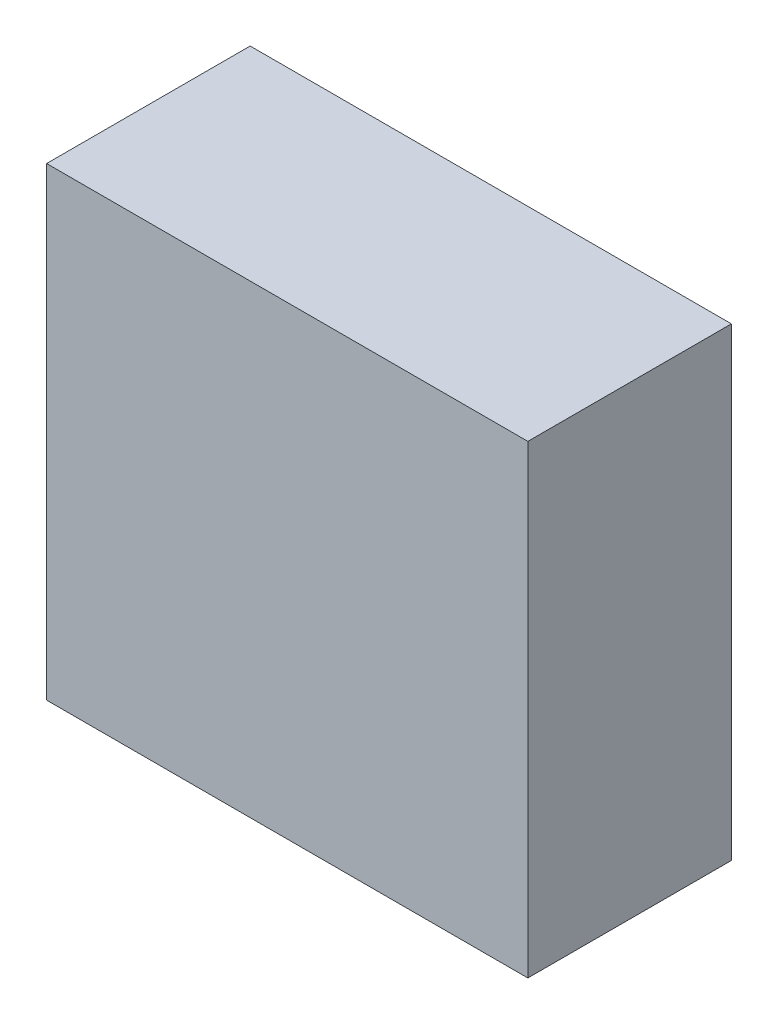
ISO-10303-21;
HEADER;
FILE_DESCRIPTION(('STEP AP214'),'2;1');
FILE_NAME('part.step','',(''),(''),'','','');
FILE_SCHEMA(('AUTOMOTIVE_DESIGN { 1 0 10303 214 1 1 1 1 }'));
ENDSEC;
DATA;
#1=APPLICATION_CONTEXT('core data for automotive mechanical design processes');
#2=APPLICATION_PROTOCOL_DEFINITION('international standard','automotive_design',2000,#1);
#3=PRODUCT_CONTEXT('',#1,'mechanical');
#4=PRODUCT('Part','Part','',(#3));
#5=PRODUCT_RELATED_PRODUCT_CATEGORY('part','',(#4));
#6=PRODUCT_DEFINITION_FORMATION('','',#4);
#7=PRODUCT_DEFINITION_CONTEXT('part definition',#1,'design');
#8=PRODUCT_DEFINITION('design','',#6,#7);
#9=PRODUCT_DEFINITION_SHAPE('','',#8);
#10=(LENGTH_UNIT() NAMED_UNIT(*) SI_UNIT(.MILLI.,.METRE.));
#11=(NAMED_UNIT(*) PLANE_ANGLE_UNIT() SI_UNIT($,.RADIAN.));
#12=(NAMED_UNIT(*) SI_UNIT($,.STERADIAN.) SOLID_ANGLE_UNIT());
#13=UNCERTAINTY_MEASURE_WITH_UNIT(LENGTH_MEASURE(1.E-05),#10,'distance_accuracy_value','');
#14=(GEOMETRIC_REPRESENTATION_CONTEXT(3) GLOBAL_UNCERTAINTY_ASSIGNED_CONTEXT((#13)) GLOBAL_UNIT_ASSIGNED_CONTEXT((#10,
#11,#12)) REPRESENTATION_CONTEXT('',''));
#15=CARTESIAN_POINT('',(0.,0.,0.));
#16=DIRECTION('',(0.,0.,1.));
#17=DIRECTION('',(1.,0.,0.));
#18=AXIS2_PLACEMENT_3D('',#15,#16,#17);
#19=CARTESIAN_POINT('',(-14.6,45.2,-43.));
#20=DIRECTION('',(1.,0.,0.));
#21=DIRECTION('',(0.,0.,-1.));
#22=AXIS2_PLACEMENT_3D('',#19,#20,#21);
#23=PLANE('',#22);
#24=DIRECTION('',(0.,0.,1.));
#25=VECTOR('',#24,1.);
#26=CARTESIAN_POINT('',(-14.6,17.,-43.));
#27=LINE('',#26,#25);
#28=CARTESIAN_POINT('',(-14.6,17.,-43.));
#29=VERTEX_POINT('',#28);
#30=CARTESIAN_POINT('',(-14.6,17.,-30.65));
#31=VERTEX_POINT('',#30);
#32=EDGE_CURVE('E102',#29,#31,#27,.T.);
#33=ORIENTED_EDGE('',*,*,#32,.T.);
#34=DIRECTION('',(0.,-1.,0.));
#35=VECTOR('',#34,1.);
#36=CARTESIAN_POINT('',(-14.6,45.2,-30.65));
#37=LINE('',#36,#35);
#38=CARTESIAN_POINT('',(-14.6,45.2,-30.65));
#39=VERTEX_POINT('',#38);
#40=EDGE_CURVE('E11',#39,#31,#37,.T.);
#41=ORIENTED_EDGE('',*,*,#40,.F.);
#42=DIRECTION('',(0.,0.,1.));
#43=VECTOR('',#42,1.);
#44=CARTESIAN_POINT('',(-14.6,45.2,-43.));
#45=LINE('',#44,#43);
#46=CARTESIAN_POINT('',(-14.6,45.2,-43.));
#47=VERTEX_POINT('',#46);
#48=EDGE_CURVE('E90',#47,#39,#45,.T.);
#49=ORIENTED_EDGE('',*,*,#48,.F.);
#50=DIRECTION('',(0.,-1.,0.));
#51=VECTOR('',#50,1.);
#52=CARTESIAN_POINT('',(-14.6,45.2,-43.));
#53=LINE('',#52,#51);
#54=EDGE_CURVE('E98',#47,#29,#53,.T.);
#55=ORIENTED_EDGE('',*,*,#54,.T.);
#56=EDGE_LOOP('',(#33,#41,#49,#55));
#57=FACE_BOUND('',#56,.T.);
#58=ADVANCED_FACE('F39',(#57),#23,.F.);
#59=CARTESIAN_POINT('',(-14.6,45.2,-30.65));
#60=DIRECTION('',(0.,0.,-1.));
#61=DIRECTION('',(-1.,0.,0.));
#62=AXIS2_PLACEMENT_3D('',#59,#60,#61);
#63=PLANE('',#62);
#64=DIRECTION('',(1.,0.,0.));
#65=VECTOR('',#64,1.);
#66=CARTESIAN_POINT('',(-14.6,17.,-30.65));
#67=LINE('',#66,#65);
#68=CARTESIAN_POINT('',(14.6,17.,-30.65));
#69=VERTEX_POINT('',#68);
#70=EDGE_CURVE('E94',#31,#69,#67,.T.);
#71=ORIENTED_EDGE('',*,*,#70,.T.);
#72=DIRECTION('',(0.,-1.,0.));
#73=VECTOR('',#72,1.);
#74=CARTESIAN_POINT('',(14.6,45.2,-30.65));
#75=LINE('',#74,#73);
#76=CARTESIAN_POINT('',(14.6,45.2,-30.65));
#77=VERTEX_POINT('',#76);
#78=EDGE_CURVE('E47',#77,#69,#75,.T.);
#79=ORIENTED_EDGE('',*,*,#78,.F.);
#80=DIRECTION('',(1.,0.,0.));
#81=VECTOR('',#80,1.);
#82=CARTESIAN_POINT('',(-14.6,45.2,-30.65));
#83=LINE('',#82,#81);
#84=EDGE_CURVE('E85',#39,#77,#83,.T.);
#85=ORIENTED_EDGE('',*,*,#84,.F.);
#86=ORIENTED_EDGE('',*,*,#40,.T.);
#87=EDGE_LOOP('',(#71,#79,#85,#86));
#88=FACE_BOUND('',#87,.T.);
#89=ADVANCED_FACE('F93',(#88),#63,.F.);
#90=CARTESIAN_POINT('',(14.6,45.2,-30.65));
#91=DIRECTION('',(-1.,0.,0.));
#92=DIRECTION('',(0.,0.,1.));
#93=AXIS2_PLACEMENT_3D('',#90,#91,#92);
#94=PLANE('',#93);
#95=DIRECTION('',(0.,0.,-1.));
#96=VECTOR('',#95,1.);
#97=CARTESIAN_POINT('',(14.6,17.,-30.65));
#98=LINE('',#97,#96);
#99=CARTESIAN_POINT('',(14.6,17.,-43.));
#100=VERTEX_POINT('',#99);
#101=EDGE_CURVE('E72',#69,#100,#98,.T.);
#102=ORIENTED_EDGE('',*,*,#101,.T.);
#103=DIRECTION('',(0.,-1.,0.));
#104=VECTOR('',#103,1.);
#105=CARTESIAN_POINT('',(14.6,45.2,-43.));
#106=LINE('',#105,#104);
#107=CARTESIAN_POINT('',(14.6,45.2,-43.));
#108=VERTEX_POINT('',#107);
#109=EDGE_CURVE('E95',#108,#100,#106,.T.);
#110=ORIENTED_EDGE('',*,*,#109,.F.);
#111=DIRECTION('',(0.,0.,-1.));
#112=VECTOR('',#111,1.);
#113=CARTESIAN_POINT('',(14.6,45.2,-30.65));
#114=LINE('',#113,#112);
#115=EDGE_CURVE('E88',#77,#108,#114,.T.);
#116=ORIENTED_EDGE('',*,*,#115,.F.);
#117=ORIENTED_EDGE('',*,*,#78,.T.);
#118=EDGE_LOOP('',(#102,#110,#116,#117));
#119=FACE_BOUND('',#118,.T.);
#120=ADVANCED_FACE('F96',(#119),#94,.F.);
#121=CARTESIAN_POINT('',(14.6,45.2,-43.));
#122=DIRECTION('',(0.,0.,1.));
#123=DIRECTION('',(1.,0.,0.));
#124=AXIS2_PLACEMENT_3D('',#121,#122,#123);
#125=PLANE('',#124);
#126=DIRECTION('',(-1.,0.,0.));
#127=VECTOR('',#126,1.);
#128=CARTESIAN_POINT('',(14.6,17.,-43.));
#129=LINE('',#128,#127);
#130=EDGE_CURVE('E78',#100,#29,#129,.T.);
#131=ORIENTED_EDGE('',*,*,#130,.T.);
#132=ORIENTED_EDGE('',*,*,#54,.F.);
#133=DIRECTION('',(-1.,0.,0.));
#134=VECTOR('',#133,1.);
#135=CARTESIAN_POINT('',(14.6,45.2,-43.));
#136=LINE('',#135,#134);
#137=EDGE_CURVE('E55',#108,#47,#136,.T.);
#138=ORIENTED_EDGE('',*,*,#137,.F.);
#139=ORIENTED_EDGE('',*,*,#109,.T.);
#140=EDGE_LOOP('',(#131,#132,#138,#139));
#141=FACE_BOUND('',#140,.T.);
#142=ADVANCED_FACE('F109',(#141),#125,.F.);
#143=CARTESIAN_POINT('',(0.,45.2,0.));
#144=DIRECTION('',(0.,1.,0.));
#145=DIRECTION('',(0.,0.,1.));
#146=AXIS2_PLACEMENT_3D('',#143,#144,#145);
#147=PLANE('',#146);
#148=ORIENTED_EDGE('',*,*,#48,.T.);
#149=ORIENTED_EDGE('',*,*,#84,.T.);
#150=ORIENTED_EDGE('',*,*,#115,.T.);
#151=ORIENTED_EDGE('',*,*,#137,.T.);
#152=EDGE_LOOP('',(#148,#149,#150,#151));
#153=FACE_BOUND('',#152,.T.);
#154=ADVANCED_FACE('F86',(#153),#147,.T.);
#155=CARTESIAN_POINT('',(0.,17.,0.));
#156=DIRECTION('',(0.,1.,0.));
#157=DIRECTION('',(0.,0.,1.));
#158=AXIS2_PLACEMENT_3D('',#155,#156,#157);
#159=PLANE('',#158);
#160=ORIENTED_EDGE('',*,*,#32,.F.);
#161=ORIENTED_EDGE('',*,*,#130,.F.);
#162=ORIENTED_EDGE('',*,*,#101,.F.);
#163=ORIENTED_EDGE('',*,*,#70,.F.);
#164=EDGE_LOOP('',(#160,#161,#162,#163));
#165=FACE_BOUND('',#164,.T.);
#166=ADVANCED_FACE('F112',(#165),#159,.F.);
#167=CLOSED_SHELL('',(#58,#89,#120,#142,#154,#166));
#168=MANIFOLD_SOLID_BREP('B2',#167);
#169=ADVANCED_BREP_SHAPE_REPRESENTATION('',(#18,#168),#14);
#170=SHAPE_DEFINITION_REPRESENTATION(#9,#169);
ENDSEC;
END-ISO-10303-21;
